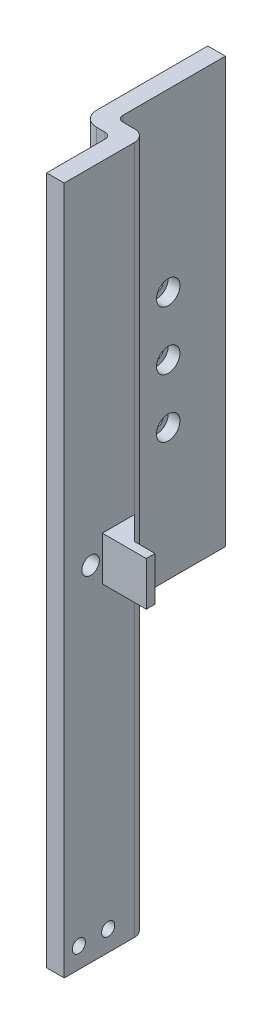
ISO-10303-21;
HEADER;
FILE_DESCRIPTION(('STEP AP214'),'2;1');
FILE_NAME('part.step','',(''),(''),'','','');
FILE_SCHEMA(('AUTOMOTIVE_DESIGN { 1 0 10303 214 1 1 1 1 }'));
ENDSEC;
DATA;
#1=APPLICATION_CONTEXT('core data for automotive mechanical design processes');
#2=APPLICATION_PROTOCOL_DEFINITION('international standard','automotive_design',2000,#1);
#3=PRODUCT_CONTEXT('',#1,'mechanical');
#4=PRODUCT('Part','Part','',(#3));
#5=PRODUCT_RELATED_PRODUCT_CATEGORY('part','',(#4));
#6=PRODUCT_DEFINITION_FORMATION('','',#4);
#7=PRODUCT_DEFINITION_CONTEXT('part definition',#1,'design');
#8=PRODUCT_DEFINITION('design','',#6,#7);
#9=PRODUCT_DEFINITION_SHAPE('','',#8);
#10=(LENGTH_UNIT() NAMED_UNIT(*) SI_UNIT(.MILLI.,.METRE.));
#11=(NAMED_UNIT(*) PLANE_ANGLE_UNIT() SI_UNIT($,.RADIAN.));
#12=(NAMED_UNIT(*) SI_UNIT($,.STERADIAN.) SOLID_ANGLE_UNIT());
#13=UNCERTAINTY_MEASURE_WITH_UNIT(LENGTH_MEASURE(1.E-05),#10,'distance_accuracy_value','');
#14=(GEOMETRIC_REPRESENTATION_CONTEXT(3) GLOBAL_UNCERTAINTY_ASSIGNED_CONTEXT((#13)) GLOBAL_UNIT_ASSIGNED_CONTEXT((#10,
#11,#12)) REPRESENTATION_CONTEXT('',''));
#15=CARTESIAN_POINT('',(0.,0.,0.));
#16=DIRECTION('',(0.,0.,1.));
#17=DIRECTION('',(1.,0.,0.));
#18=AXIS2_PLACEMENT_3D('',#15,#16,#17);
#19=CARTESIAN_POINT('',(16.,0.,0.));
#20=DIRECTION('',(-1.,0.,0.));
#21=DIRECTION('',(0.,0.,1.));
#22=AXIS2_PLACEMENT_3D('',#19,#20,#21);
#23=PLANE('',#22);
#24=CARTESIAN_POINT('',(16.,117.5,13.));
#25=DIRECTION('',(1.,0.,0.));
#26=DIRECTION('',(0.,0.,-1.));
#27=AXIS2_PLACEMENT_3D('',#24,#25,#26);
#28=CIRCLE('',#27,3.);
#29=CARTESIAN_POINT('',(16.,117.5,10.));
#30=VERTEX_POINT('',#29);
#31=EDGE_CURVE('E434',#30,#30,#28,.T.);
#32=ORIENTED_EDGE('',*,*,#31,.F.);
#33=EDGE_LOOP('',(#32));
#34=FACE_BOUND('',#33,.T.);
#35=DIRECTION('',(0.,0.,1.));
#36=VECTOR('',#35,1.);
#37=CARTESIAN_POINT('',(16.,125.,9.));
#38=LINE('',#37,#36);
#39=CARTESIAN_POINT('',(16.,125.,-2.));
#40=VERTEX_POINT('',#39);
#41=CARTESIAN_POINT('',(16.,125.,9.));
#42=VERTEX_POINT('',#41);
#43=EDGE_CURVE('E61',#40,#42,#38,.T.);
#44=ORIENTED_EDGE('',*,*,#43,.F.);
#45=DIRECTION('',(0.,-1.,0.));
#46=VECTOR('',#45,1.);
#47=CARTESIAN_POINT('',(16.,0.,-2.));
#48=LINE('',#47,#46);
#49=CARTESIAN_POINT('',(16.,235.,-2.));
#50=VERTEX_POINT('',#49);
#51=EDGE_CURVE('E390',#40,#50,#48,.F.);
#52=ORIENTED_EDGE('',*,*,#51,.T.);
#53=DIRECTION('',(0.,0.,-1.));
#54=VECTOR('',#53,1.);
#55=CARTESIAN_POINT('',(16.,235.,22.));
#56=LINE('',#55,#54);
#57=CARTESIAN_POINT('',(16.,235.,22.));
#58=VERTEX_POINT('',#57);
#59=EDGE_CURVE('E322',#58,#50,#56,.T.);
#60=ORIENTED_EDGE('',*,*,#59,.F.);
#61=DIRECTION('',(0.,1.,0.));
#62=VECTOR('',#61,1.);
#63=CARTESIAN_POINT('',(16.,0.,22.));
#64=LINE('',#63,#62);
#65=CARTESIAN_POINT('',(16.,0.,22.));
#66=VERTEX_POINT('',#65);
#67=EDGE_CURVE('E317',#66,#58,#64,.T.);
#68=ORIENTED_EDGE('',*,*,#67,.F.);
#69=DIRECTION('',(0.,0.,1.));
#70=VECTOR('',#69,1.);
#71=CARTESIAN_POINT('',(16.,0.,-43.));
#72=LINE('',#71,#70);
#73=CARTESIAN_POINT('',(16.,0.,-2.));
#74=VERTEX_POINT('',#73);
#75=EDGE_CURVE('E314',#74,#66,#72,.T.);
#76=ORIENTED_EDGE('',*,*,#75,.F.);
#77=CARTESIAN_POINT('',(16.,110.,-2.));
#78=VERTEX_POINT('',#77);
#79=EDGE_CURVE('E391',#74,#78,#48,.F.);
#80=ORIENTED_EDGE('',*,*,#79,.T.);
#81=DIRECTION('',(0.,0.,-1.));
#82=VECTOR('',#81,1.);
#83=CARTESIAN_POINT('',(16.,110.,9.));
#84=LINE('',#83,#82);
#85=CARTESIAN_POINT('',(16.,110.,9.));
#86=VERTEX_POINT('',#85);
#87=EDGE_CURVE('E68',#86,#78,#84,.T.);
#88=ORIENTED_EDGE('',*,*,#87,.F.);
#89=DIRECTION('',(0.,-1.,0.));
#90=VECTOR('',#89,1.);
#91=CARTESIAN_POINT('',(16.,110.,9.));
#92=LINE('',#91,#90);
#93=EDGE_CURVE('E201',#42,#86,#92,.T.);
#94=ORIENTED_EDGE('',*,*,#93,.F.);
#95=EDGE_LOOP('',(#44,#52,#60,#68,#76,#80,#88,#94));
#96=FACE_BOUND('',#95,.T.);
#97=CARTESIAN_POINT('',(16.,7.,7.));
#98=DIRECTION('',(-1.,0.,0.));
#99=DIRECTION('',(0.,0.,1.));
#100=AXIS2_PLACEMENT_3D('',#97,#98,#99);
#101=CIRCLE('',#100,2.24999999999998);
#102=CARTESIAN_POINT('',(16.,7.,9.24999999999998));
#103=VERTEX_POINT('',#102);
#104=EDGE_CURVE('E218',#103,#103,#101,.T.);
#105=ORIENTED_EDGE('',*,*,#104,.T.);
#106=EDGE_LOOP('',(#105));
#107=FACE_BOUND('',#106,.T.);
#108=CARTESIAN_POINT('',(16.,7.,17.));
#109=DIRECTION('',(-1.,0.,0.));
#110=DIRECTION('',(0.,0.,1.));
#111=AXIS2_PLACEMENT_3D('',#108,#109,#110);
#112=CIRCLE('',#111,2.24999999999998);
#113=CARTESIAN_POINT('',(16.,7.,19.25));
#114=VERTEX_POINT('',#113);
#115=EDGE_CURVE('E208',#114,#114,#112,.T.);
#116=ORIENTED_EDGE('',*,*,#115,.T.);
#117=EDGE_LOOP('',(#116));
#118=FACE_BOUND('',#117,.T.);
#119=ADVANCED_FACE('F44',(#34,#96,#107,#118),#23,.F.);
#120=CARTESIAN_POINT('',(10.,235.,0.));
#121=DIRECTION('',(1.,0.,0.));
#122=DIRECTION('',(0.,0.,-1.));
#123=AXIS2_PLACEMENT_3D('',#120,#121,#122);
#124=PLANE('',#123);
#125=CARTESIAN_POINT('',(10.,117.5,13.));
#126=DIRECTION('',(1.,0.,0.));
#127=DIRECTION('',(0.,0.,-1.));
#128=AXIS2_PLACEMENT_3D('',#125,#126,#127);
#129=CIRCLE('',#128,3.);
#130=CARTESIAN_POINT('',(10.,117.5,10.));
#131=VERTEX_POINT('',#130);
#132=EDGE_CURVE('E430',#131,#131,#129,.T.);
#133=ORIENTED_EDGE('',*,*,#132,.T.);
#134=EDGE_LOOP('',(#133));
#135=FACE_BOUND('',#134,.T.);
#136=CARTESIAN_POINT('',(10.,7.,17.));
#137=DIRECTION('',(-1.,0.,0.));
#138=DIRECTION('',(0.,0.,1.));
#139=AXIS2_PLACEMENT_3D('',#136,#137,#138);
#140=CIRCLE('',#139,2.24999999999999);
#141=CARTESIAN_POINT('',(10.,7.,19.25));
#142=VERTEX_POINT('',#141);
#143=EDGE_CURVE('E203',#142,#142,#140,.T.);
#144=ORIENTED_EDGE('',*,*,#143,.F.);
#145=EDGE_LOOP('',(#144));
#146=FACE_BOUND('',#145,.T.);
#147=DIRECTION('',(0.,0.,1.));
#148=VECTOR('',#147,1.);
#149=CARTESIAN_POINT('',(10.,235.,0.));
#150=LINE('',#149,#148);
#151=CARTESIAN_POINT('',(10.,235.,2.));
#152=VERTEX_POINT('',#151);
#153=CARTESIAN_POINT('',(10.,235.,22.));
#154=VERTEX_POINT('',#153);
#155=EDGE_CURVE('E274',#152,#154,#150,.T.);
#156=ORIENTED_EDGE('',*,*,#155,.F.);
#157=DIRECTION('',(0.,-1.,0.));
#158=VECTOR('',#157,1.);
#159=CARTESIAN_POINT('',(10.,0.,2.));
#160=LINE('',#159,#158);
#161=CARTESIAN_POINT('',(10.,0.,2.));
#162=VERTEX_POINT('',#161);
#163=EDGE_CURVE('E354',#152,#162,#160,.T.);
#164=ORIENTED_EDGE('',*,*,#163,.T.);
#165=DIRECTION('',(0.,0.,1.));
#166=VECTOR('',#165,1.);
#167=CARTESIAN_POINT('',(10.,0.,0.));
#168=LINE('',#167,#166);
#169=CARTESIAN_POINT('',(10.,0.,22.));
#170=VERTEX_POINT('',#169);
#171=EDGE_CURVE('E275',#162,#170,#168,.T.);
#172=ORIENTED_EDGE('',*,*,#171,.T.);
#173=DIRECTION('',(0.,-1.,0.));
#174=VECTOR('',#173,1.);
#175=CARTESIAN_POINT('',(10.,235.,22.));
#176=LINE('',#175,#174);
#177=EDGE_CURVE('E278',#154,#170,#176,.T.);
#178=ORIENTED_EDGE('',*,*,#177,.F.);
#179=EDGE_LOOP('',(#156,#164,#172,#178));
#180=FACE_BOUND('',#179,.T.);
#181=CARTESIAN_POINT('',(10.,7.,7.));
#182=DIRECTION('',(-1.,0.,0.));
#183=DIRECTION('',(0.,0.,1.));
#184=AXIS2_PLACEMENT_3D('',#181,#182,#183);
#185=CIRCLE('',#184,2.24999999999999);
#186=CARTESIAN_POINT('',(10.,7.,9.24999999999999));
#187=VERTEX_POINT('',#186);
#188=EDGE_CURVE('E214',#187,#187,#185,.T.);
#189=ORIENTED_EDGE('',*,*,#188,.F.);
#190=EDGE_LOOP('',(#189));
#191=FACE_BOUND('',#190,.T.);
#192=ADVANCED_FACE('F480',(#135,#146,#180,#191),#124,.F.);
#193=CARTESIAN_POINT('',(16.,235.,-43.));
#194=DIRECTION('',(0.,0.,-1.));
#195=DIRECTION('',(-1.,0.,0.));
#196=AXIS2_PLACEMENT_3D('',#193,#194,#195);
#197=PLANE('',#196);
#198=DIRECTION('',(-1.,0.,0.));
#199=VECTOR('',#198,1.);
#200=CARTESIAN_POINT('',(16.,90.,-43.));
#201=LINE('',#200,#199);
#202=CARTESIAN_POINT('',(6.,90.,-43.));
#203=VERTEX_POINT('',#202);
#204=CARTESIAN_POINT('',(0.,90.,-43.));
#205=VERTEX_POINT('',#204);
#206=EDGE_CURVE('E294',#203,#205,#201,.T.);
#207=ORIENTED_EDGE('',*,*,#206,.T.);
#208=DIRECTION('',(0.,-1.,0.));
#209=VECTOR('',#208,1.);
#210=CARTESIAN_POINT('',(0.,235.,-43.));
#211=LINE('',#210,#209);
#212=CARTESIAN_POINT('',(0.,235.,-43.));
#213=VERTEX_POINT('',#212);
#214=EDGE_CURVE('E313',#213,#205,#211,.T.);
#215=ORIENTED_EDGE('',*,*,#214,.F.);
#216=DIRECTION('',(-1.,0.,0.));
#217=VECTOR('',#216,1.);
#218=CARTESIAN_POINT('',(16.,235.,-43.));
#219=LINE('',#218,#217);
#220=CARTESIAN_POINT('',(6.,235.,-43.));
#221=VERTEX_POINT('',#220);
#222=EDGE_CURVE('E336',#221,#213,#219,.T.);
#223=ORIENTED_EDGE('',*,*,#222,.F.);
#224=DIRECTION('',(0.,-1.,0.));
#225=VECTOR('',#224,1.);
#226=CARTESIAN_POINT('',(6.,235.,-43.));
#227=LINE('',#226,#225);
#228=EDGE_CURVE('E307',#221,#203,#227,.T.);
#229=ORIENTED_EDGE('',*,*,#228,.T.);
#230=EDGE_LOOP('',(#207,#215,#223,#229));
#231=FACE_BOUND('',#230,.T.);
#232=ADVANCED_FACE('F543',(#231),#197,.T.);
#233=CARTESIAN_POINT('',(16.,235.,22.));
#234=DIRECTION('',(0.,1.,0.));
#235=DIRECTION('',(0.,0.,1.));
#236=AXIS2_PLACEMENT_3D('',#233,#234,#235);
#237=PLANE('',#236);
#238=DIRECTION('',(0.,0.,-1.));
#239=VECTOR('',#238,1.);
#240=CARTESIAN_POINT('',(0.,235.,22.));
#241=LINE('',#240,#239);
#242=CARTESIAN_POINT('',(0.,235.,-5.));
#243=VERTEX_POINT('',#242);
#244=EDGE_CURVE('E318',#243,#213,#241,.T.);
#245=ORIENTED_EDGE('',*,*,#244,.F.);
#246=CARTESIAN_POINT('',(5.,235.,-5.));
#247=DIRECTION('',(0.,1.,0.));
#248=DIRECTION('',(0.,0.,1.));
#249=AXIS2_PLACEMENT_3D('',#246,#247,#248);
#250=CIRCLE('',#249,5.);
#251=CARTESIAN_POINT('',(5.,235.,0.));
#252=VERTEX_POINT('',#251);
#253=EDGE_CURVE('E409',#243,#252,#250,.T.);
#254=ORIENTED_EDGE('',*,*,#253,.T.);
#255=DIRECTION('',(1.,0.,0.));
#256=VECTOR('',#255,1.);
#257=CARTESIAN_POINT('',(0.,235.,0.));
#258=LINE('',#257,#256);
#259=CARTESIAN_POINT('',(8.,235.,0.));
#260=VERTEX_POINT('',#259);
#261=EDGE_CURVE('E271',#252,#260,#258,.T.);
#262=ORIENTED_EDGE('',*,*,#261,.T.);
#263=CARTESIAN_POINT('',(8.,235.,2.));
#264=DIRECTION('',(0.,1.,0.));
#265=DIRECTION('',(0.,0.,1.));
#266=AXIS2_PLACEMENT_3D('',#263,#264,#265);
#267=CIRCLE('',#266,2.);
#268=EDGE_CURVE('E373',#260,#152,#267,.F.);
#269=ORIENTED_EDGE('',*,*,#268,.T.);
#270=ORIENTED_EDGE('',*,*,#155,.T.);
#271=DIRECTION('',(-1.,0.,0.));
#272=VECTOR('',#271,1.);
#273=CARTESIAN_POINT('',(16.,235.,22.));
#274=LINE('',#273,#272);
#275=EDGE_CURVE('E341',#58,#154,#274,.T.);
#276=ORIENTED_EDGE('',*,*,#275,.F.);
#277=ORIENTED_EDGE('',*,*,#59,.T.);
#278=CARTESIAN_POINT('',(12.,235.,-2.));
#279=DIRECTION('',(0.,1.,0.));
#280=DIRECTION('',(0.,0.,1.));
#281=AXIS2_PLACEMENT_3D('',#278,#279,#280);
#282=CIRCLE('',#281,4.);
#283=CARTESIAN_POINT('',(12.,235.,-6.));
#284=VERTEX_POINT('',#283);
#285=EDGE_CURVE('E395',#50,#284,#282,.T.);
#286=ORIENTED_EDGE('',*,*,#285,.T.);
#287=DIRECTION('',(-1.,0.,0.));
#288=VECTOR('',#287,1.);
#289=CARTESIAN_POINT('',(16.,235.,-6.));
#290=LINE('',#289,#288);
#291=CARTESIAN_POINT('',(8.,235.,-6.));
#292=VERTEX_POINT('',#291);
#293=EDGE_CURVE('E301',#284,#292,#290,.T.);
#294=ORIENTED_EDGE('',*,*,#293,.T.);
#295=CARTESIAN_POINT('',(8.,235.,-8.));
#296=DIRECTION('',(0.,1.,0.));
#297=DIRECTION('',(0.,0.,1.));
#298=AXIS2_PLACEMENT_3D('',#295,#296,#297);
#299=CIRCLE('',#298,2.);
#300=CARTESIAN_POINT('',(6.,235.,-8.));
#301=VERTEX_POINT('',#300);
#302=EDGE_CURVE('E380',#292,#301,#299,.F.);
#303=ORIENTED_EDGE('',*,*,#302,.T.);
#304=DIRECTION('',(0.,0.,-1.));
#305=VECTOR('',#304,1.);
#306=CARTESIAN_POINT('',(6.,235.,-6.00000000000001));
#307=LINE('',#306,#305);
#308=EDGE_CURVE('E304',#301,#221,#307,.T.);
#309=ORIENTED_EDGE('',*,*,#308,.T.);
#310=ORIENTED_EDGE('',*,*,#222,.T.);
#311=EDGE_LOOP('',(#245,#254,#262,#269,#270,#276,#277,#286,#294,#303,#309,#310));
#312=FACE_BOUND('',#311,.T.);
#313=ADVANCED_FACE('F569',(#312),#237,.T.);
#314=CARTESIAN_POINT('',(16.,0.,22.));
#315=DIRECTION('',(0.,0.,1.));
#316=DIRECTION('',(1.,0.,0.));
#317=AXIS2_PLACEMENT_3D('',#314,#315,#316);
#318=PLANE('',#317);
#319=ORIENTED_EDGE('',*,*,#177,.T.);
#320=DIRECTION('',(-1.,0.,0.));
#321=VECTOR('',#320,1.);
#322=CARTESIAN_POINT('',(16.,0.,22.));
#323=LINE('',#322,#321);
#324=EDGE_CURVE('E326',#66,#170,#323,.T.);
#325=ORIENTED_EDGE('',*,*,#324,.F.);
#326=ORIENTED_EDGE('',*,*,#67,.T.);
#327=ORIENTED_EDGE('',*,*,#275,.T.);
#328=EDGE_LOOP('',(#319,#325,#326,#327));
#329=FACE_BOUND('',#328,.T.);
#330=ADVANCED_FACE('F572',(#329),#318,.T.);
#331=CARTESIAN_POINT('',(16.,0.,-43.));
#332=DIRECTION('',(0.,-1.,0.));
#333=DIRECTION('',(0.,0.,-1.));
#334=AXIS2_PLACEMENT_3D('',#331,#332,#333);
#335=PLANE('',#334);
#336=DIRECTION('',(1.,0.,0.));
#337=VECTOR('',#336,1.);
#338=CARTESIAN_POINT('',(0.,0.,0.));
#339=LINE('',#338,#337);
#340=CARTESIAN_POINT('',(5.,0.,0.));
#341=VERTEX_POINT('',#340);
#342=CARTESIAN_POINT('',(8.,0.,0.));
#343=VERTEX_POINT('',#342);
#344=EDGE_CURVE('E270',#341,#343,#339,.T.);
#345=ORIENTED_EDGE('',*,*,#344,.F.);
#346=CARTESIAN_POINT('',(5.,0.,-5.));
#347=DIRECTION('',(0.,-1.,0.));
#348=DIRECTION('',(0.,0.,-1.));
#349=AXIS2_PLACEMENT_3D('',#346,#347,#348);
#350=CIRCLE('',#349,5.);
#351=CARTESIAN_POINT('',(0.,0.,-5.));
#352=VERTEX_POINT('',#351);
#353=EDGE_CURVE('E403',#341,#352,#350,.T.);
#354=ORIENTED_EDGE('',*,*,#353,.T.);
#355=DIRECTION('',(0.,0.,1.));
#356=VECTOR('',#355,1.);
#357=CARTESIAN_POINT('',(0.,0.,-43.));
#358=LINE('',#357,#356);
#359=CARTESIAN_POINT('',(0.,0.,-8.));
#360=VERTEX_POINT('',#359);
#361=EDGE_CURVE('E330',#360,#352,#358,.T.);
#362=ORIENTED_EDGE('',*,*,#361,.F.);
#363=DIRECTION('',(-1.,0.,0.));
#364=VECTOR('',#363,1.);
#365=CARTESIAN_POINT('',(16.,0.,-8.));
#366=LINE('',#365,#364);
#367=CARTESIAN_POINT('',(6.,0.,-8.));
#368=VERTEX_POINT('',#367);
#369=EDGE_CURVE('E293',#368,#360,#366,.T.);
#370=ORIENTED_EDGE('',*,*,#369,.F.);
#371=CARTESIAN_POINT('',(8.,0.,-8.));
#372=DIRECTION('',(0.,-1.,0.));
#373=DIRECTION('',(0.,0.,-1.));
#374=AXIS2_PLACEMENT_3D('',#371,#372,#373);
#375=CIRCLE('',#374,2.);
#376=CARTESIAN_POINT('',(8.,0.,-6.));
#377=VERTEX_POINT('',#376);
#378=EDGE_CURVE('E376',#368,#377,#375,.F.);
#379=ORIENTED_EDGE('',*,*,#378,.T.);
#380=DIRECTION('',(-1.,0.,0.));
#381=VECTOR('',#380,1.);
#382=CARTESIAN_POINT('',(16.,0.,-6.));
#383=LINE('',#382,#381);
#384=CARTESIAN_POINT('',(12.,0.,-6.));
#385=VERTEX_POINT('',#384);
#386=EDGE_CURVE('E298',#385,#377,#383,.T.);
#387=ORIENTED_EDGE('',*,*,#386,.F.);
#388=CARTESIAN_POINT('',(12.,0.,-2.));
#389=DIRECTION('',(0.,-1.,0.));
#390=DIRECTION('',(0.,0.,-1.));
#391=AXIS2_PLACEMENT_3D('',#388,#389,#390);
#392=CIRCLE('',#391,4.);
#393=EDGE_CURVE('E387',#385,#74,#392,.T.);
#394=ORIENTED_EDGE('',*,*,#393,.T.);
#395=ORIENTED_EDGE('',*,*,#75,.T.);
#396=ORIENTED_EDGE('',*,*,#324,.T.);
#397=ORIENTED_EDGE('',*,*,#171,.F.);
#398=CARTESIAN_POINT('',(8.,0.,2.));
#399=DIRECTION('',(0.,-1.,0.));
#400=DIRECTION('',(0.,0.,-1.));
#401=AXIS2_PLACEMENT_3D('',#398,#399,#400);
#402=CIRCLE('',#401,2.);
#403=EDGE_CURVE('E369',#162,#343,#402,.F.);
#404=ORIENTED_EDGE('',*,*,#403,.T.);
#405=EDGE_LOOP('',(#345,#354,#362,#370,#379,#387,#394,#395,#396,#397,#404));
#406=FACE_BOUND('',#405,.T.);
#407=ADVANCED_FACE('F567',(#406),#335,.T.);
#408=CARTESIAN_POINT('',(0.,0.,0.));
#409=DIRECTION('',(-1.,0.,0.));
#410=DIRECTION('',(0.,0.,1.));
#411=AXIS2_PLACEMENT_3D('',#408,#409,#410);
#412=PLANE('',#411);
#413=CARTESIAN_POINT('',(0.,175.,-23.5));
#414=DIRECTION('',(1.,0.,0.));
#415=DIRECTION('',(0.,0.,-1.));
#416=AXIS2_PLACEMENT_3D('',#413,#414,#415);
#417=CIRCLE('',#416,2.25);
#418=CARTESIAN_POINT('',(0.,175.,-25.75));
#419=VERTEX_POINT('',#418);
#420=EDGE_CURVE('E234',#419,#419,#417,.T.);
#421=ORIENTED_EDGE('',*,*,#420,.T.);
#422=EDGE_LOOP('',(#421));
#423=FACE_BOUND('',#422,.T.);
#424=CARTESIAN_POINT('',(0.,155.,-23.5));
#425=DIRECTION('',(1.,0.,0.));
#426=DIRECTION('',(0.,0.,-1.));
#427=AXIS2_PLACEMENT_3D('',#424,#425,#426);
#428=CIRCLE('',#427,2.25);
#429=CARTESIAN_POINT('',(0.,155.,-25.75));
#430=VERTEX_POINT('',#429);
#431=EDGE_CURVE('E250',#430,#430,#428,.T.);
#432=ORIENTED_EDGE('',*,*,#431,.T.);
#433=EDGE_LOOP('',(#432));
#434=FACE_BOUND('',#433,.T.);
#435=CARTESIAN_POINT('',(0.,135.,-23.5));
#436=DIRECTION('',(1.,0.,0.));
#437=DIRECTION('',(0.,0.,-1.));
#438=AXIS2_PLACEMENT_3D('',#435,#436,#437);
#439=CIRCLE('',#438,2.25);
#440=CARTESIAN_POINT('',(0.,135.,-25.75));
#441=VERTEX_POINT('',#440);
#442=EDGE_CURVE('E266',#441,#441,#439,.T.);
#443=ORIENTED_EDGE('',*,*,#442,.T.);
#444=EDGE_LOOP('',(#443));
#445=FACE_BOUND('',#444,.T.);
#446=ORIENTED_EDGE('',*,*,#361,.T.);
#447=DIRECTION('',(0.,-1.,0.));
#448=VECTOR('',#447,1.);
#449=CARTESIAN_POINT('',(0.,235.,-5.));
#450=LINE('',#449,#448);
#451=EDGE_CURVE('E406',#352,#243,#450,.F.);
#452=ORIENTED_EDGE('',*,*,#451,.T.);
#453=ORIENTED_EDGE('',*,*,#244,.T.);
#454=ORIENTED_EDGE('',*,*,#214,.T.);
#455=DIRECTION('',(0.,0.,-1.));
#456=VECTOR('',#455,1.);
#457=CARTESIAN_POINT('',(0.,90.,-8.));
#458=LINE('',#457,#456);
#459=CARTESIAN_POINT('',(0.,90.,-14.));
#460=VERTEX_POINT('',#459);
#461=EDGE_CURVE('E290',#460,#205,#458,.T.);
#462=ORIENTED_EDGE('',*,*,#461,.F.);
#463=CARTESIAN_POINT('',(0.,84.,-14.));
#464=DIRECTION('',(-1.,0.,0.));
#465=DIRECTION('',(0.,0.,1.));
#466=AXIS2_PLACEMENT_3D('',#463,#464,#465);
#467=CIRCLE('',#466,6.);
#468=CARTESIAN_POINT('',(0.,84.,-8.));
#469=VERTEX_POINT('',#468);
#470=EDGE_CURVE('E420',#460,#469,#467,.F.);
#471=ORIENTED_EDGE('',*,*,#470,.T.);
#472=DIRECTION('',(0.,1.,0.));
#473=VECTOR('',#472,1.);
#474=CARTESIAN_POINT('',(0.,0.,-8.));
#475=LINE('',#474,#473);
#476=EDGE_CURVE('E286',#360,#469,#475,.T.);
#477=ORIENTED_EDGE('',*,*,#476,.F.);
#478=EDGE_LOOP('',(#446,#452,#453,#454,#462,#471,#477));
#479=FACE_BOUND('',#478,.T.);
#480=ADVANCED_FACE('F560',(#423,#434,#445,#479),#412,.T.);
#481=CARTESIAN_POINT('',(6.,235.,-6.00000000000001));
#482=DIRECTION('',(-1.,0.,0.));
#483=DIRECTION('',(0.,0.,1.));
#484=AXIS2_PLACEMENT_3D('',#481,#482,#483);
#485=PLANE('',#484);
#486=CARTESIAN_POINT('',(6.,175.,-23.5));
#487=DIRECTION('',(1.,0.,0.));
#488=DIRECTION('',(0.,0.,-1.));
#489=AXIS2_PLACEMENT_3D('',#486,#487,#488);
#490=CIRCLE('',#489,4.);
#491=CARTESIAN_POINT('',(6.,175.,-27.5));
#492=VERTEX_POINT('',#491);
#493=EDGE_CURVE('E222',#492,#492,#490,.T.);
#494=ORIENTED_EDGE('',*,*,#493,.F.);
#495=EDGE_LOOP('',(#494));
#496=FACE_BOUND('',#495,.T.);
#497=CARTESIAN_POINT('',(6.,155.,-23.5));
#498=DIRECTION('',(1.,0.,0.));
#499=DIRECTION('',(0.,0.,-1.));
#500=AXIS2_PLACEMENT_3D('',#497,#498,#499);
#501=CIRCLE('',#500,4.);
#502=CARTESIAN_POINT('',(6.,155.,-27.5));
#503=VERTEX_POINT('',#502);
#504=EDGE_CURVE('E238',#503,#503,#501,.T.);
#505=ORIENTED_EDGE('',*,*,#504,.F.);
#506=EDGE_LOOP('',(#505));
#507=FACE_BOUND('',#506,.T.);
#508=CARTESIAN_POINT('',(6.,135.,-23.5));
#509=DIRECTION('',(1.,0.,0.));
#510=DIRECTION('',(0.,0.,-1.));
#511=AXIS2_PLACEMENT_3D('',#508,#509,#510);
#512=CIRCLE('',#511,4.);
#513=CARTESIAN_POINT('',(6.,135.,-27.5));
#514=VERTEX_POINT('',#513);
#515=EDGE_CURVE('E254',#514,#514,#512,.T.);
#516=ORIENTED_EDGE('',*,*,#515,.F.);
#517=EDGE_LOOP('',(#516));
#518=FACE_BOUND('',#517,.T.);
#519=ORIENTED_EDGE('',*,*,#308,.F.);
#520=DIRECTION('',(0.,-1.,0.));
#521=VECTOR('',#520,1.);
#522=CARTESIAN_POINT('',(6.,0.,-8.));
#523=LINE('',#522,#521);
#524=CARTESIAN_POINT('',(6.,84.,-8.));
#525=VERTEX_POINT('',#524);
#526=EDGE_CURVE('E362',#301,#525,#523,.T.);
#527=ORIENTED_EDGE('',*,*,#526,.T.);
#528=CARTESIAN_POINT('',(6.,84.,-14.));
#529=DIRECTION('',(-1.,0.,0.));
#530=DIRECTION('',(0.,0.,1.));
#531=AXIS2_PLACEMENT_3D('',#528,#529,#530);
#532=CIRCLE('',#531,6.);
#533=CARTESIAN_POINT('',(6.,90.,-14.));
#534=VERTEX_POINT('',#533);
#535=EDGE_CURVE('E423',#525,#534,#532,.T.);
#536=ORIENTED_EDGE('',*,*,#535,.T.);
#537=DIRECTION('',(0.,0.,-1.));
#538=VECTOR('',#537,1.);
#539=CARTESIAN_POINT('',(6.,90.,-6.00000000000001));
#540=LINE('',#539,#538);
#541=EDGE_CURVE('E351',#534,#203,#540,.T.);
#542=ORIENTED_EDGE('',*,*,#541,.T.);
#543=ORIENTED_EDGE('',*,*,#228,.F.);
#544=EDGE_LOOP('',(#519,#527,#536,#542,#543));
#545=FACE_BOUND('',#544,.T.);
#546=ADVANCED_FACE('F557',(#496,#507,#518,#545),#485,.F.);
#547=CARTESIAN_POINT('',(16.,235.,-6.));
#548=DIRECTION('',(0.,0.,1.));
#549=DIRECTION('',(1.,0.,0.));
#550=AXIS2_PLACEMENT_3D('',#547,#548,#549);
#551=PLANE('',#550);
#552=ORIENTED_EDGE('',*,*,#293,.F.);
#553=DIRECTION('',(0.,-1.,0.));
#554=VECTOR('',#553,1.);
#555=CARTESIAN_POINT('',(12.,235.,-6.));
#556=LINE('',#555,#554);
#557=EDGE_CURVE('E383',#284,#385,#556,.T.);
#558=ORIENTED_EDGE('',*,*,#557,.T.);
#559=ORIENTED_EDGE('',*,*,#386,.T.);
#560=DIRECTION('',(0.,-1.,0.));
#561=VECTOR('',#560,1.);
#562=CARTESIAN_POINT('',(8.,235.,-6.));
#563=LINE('',#562,#561);
#564=EDGE_CURVE('E365',#377,#292,#563,.F.);
#565=ORIENTED_EDGE('',*,*,#564,.T.);
#566=EDGE_LOOP('',(#552,#558,#559,#565));
#567=FACE_BOUND('',#566,.T.);
#568=ADVANCED_FACE('F552',(#567),#551,.F.);
#569=CARTESIAN_POINT('',(16.,90.,-8.));
#570=DIRECTION('',(0.,1.,0.));
#571=DIRECTION('',(-1.,0.,0.));
#572=AXIS2_PLACEMENT_3D('',#569,#570,#571);
#573=PLANE('',#572);
#574=ORIENTED_EDGE('',*,*,#541,.F.);
#575=DIRECTION('',(-1.,0.,0.));
#576=VECTOR('',#575,1.);
#577=CARTESIAN_POINT('',(0.,90.,-14.));
#578=LINE('',#577,#576);
#579=EDGE_CURVE('E412',#534,#460,#578,.T.);
#580=ORIENTED_EDGE('',*,*,#579,.T.);
#581=ORIENTED_EDGE('',*,*,#461,.T.);
#582=ORIENTED_EDGE('',*,*,#206,.F.);
#583=EDGE_LOOP('',(#574,#580,#581,#582));
#584=FACE_BOUND('',#583,.T.);
#585=ADVANCED_FACE('F549',(#584),#573,.F.);
#586=CARTESIAN_POINT('',(16.,0.,-8.));
#587=DIRECTION('',(0.,0.,1.));
#588=DIRECTION('',(1.,0.,0.));
#589=AXIS2_PLACEMENT_3D('',#586,#587,#588);
#590=PLANE('',#589);
#591=ORIENTED_EDGE('',*,*,#476,.T.);
#592=DIRECTION('',(-1.,0.,0.));
#593=VECTOR('',#592,1.);
#594=CARTESIAN_POINT('',(6.,84.,-8.));
#595=LINE('',#594,#593);
#596=EDGE_CURVE('E416',#469,#525,#595,.F.);
#597=ORIENTED_EDGE('',*,*,#596,.T.);
#598=DIRECTION('',(0.,1.,0.));
#599=VECTOR('',#598,1.);
#600=CARTESIAN_POINT('',(6.,235.,-8.));
#601=LINE('',#600,#599);
#602=EDGE_CURVE('E340',#368,#525,#601,.T.);
#603=ORIENTED_EDGE('',*,*,#602,.F.);
#604=ORIENTED_EDGE('',*,*,#369,.T.);
#605=EDGE_LOOP('',(#591,#597,#603,#604));
#606=FACE_BOUND('',#605,.T.);
#607=ADVANCED_FACE('F547',(#606),#590,.F.);
#608=CARTESIAN_POINT('',(0.,235.,0.));
#609=DIRECTION('',(0.,0.,-1.));
#610=DIRECTION('',(-1.,0.,0.));
#611=AXIS2_PLACEMENT_3D('',#608,#609,#610);
#612=PLANE('',#611);
#613=ORIENTED_EDGE('',*,*,#261,.F.);
#614=DIRECTION('',(0.,-1.,0.));
#615=VECTOR('',#614,1.);
#616=CARTESIAN_POINT('',(5.,0.,0.));
#617=LINE('',#616,#615);
#618=EDGE_CURVE('E399',#252,#341,#617,.T.);
#619=ORIENTED_EDGE('',*,*,#618,.T.);
#620=ORIENTED_EDGE('',*,*,#344,.T.);
#621=DIRECTION('',(0.,-1.,0.));
#622=VECTOR('',#621,1.);
#623=CARTESIAN_POINT('',(8.,235.,0.));
#624=LINE('',#623,#622);
#625=EDGE_CURVE('E358',#343,#260,#624,.F.);
#626=ORIENTED_EDGE('',*,*,#625,.T.);
#627=EDGE_LOOP('',(#613,#619,#620,#626));
#628=FACE_BOUND('',#627,.T.);
#629=ADVANCED_FACE('F539',(#628),#612,.F.);
#630=CARTESIAN_POINT('',(6.,135.,-23.5));
#631=DIRECTION('',(1.,0.,0.));
#632=DIRECTION('',(0.,0.,-1.));
#633=AXIS2_PLACEMENT_3D('',#630,#631,#632);
#634=CYLINDRICAL_SURFACE('',#633,2.25);
#635=ORIENTED_EDGE('',*,*,#442,.F.);
#636=EDGE_LOOP('',(#635));
#637=FACE_BOUND('',#636,.T.);
#638=CARTESIAN_POINT('',(2.,135.,-23.5));
#639=DIRECTION('',(1.,0.,0.));
#640=DIRECTION('',(0.,0.,-1.));
#641=AXIS2_PLACEMENT_3D('',#638,#639,#640);
#642=CIRCLE('',#641,2.25);
#643=CARTESIAN_POINT('',(2.,135.,-25.75));
#644=VERTEX_POINT('',#643);
#645=EDGE_CURVE('E262',#644,#644,#642,.T.);
#646=ORIENTED_EDGE('',*,*,#645,.T.);
#647=EDGE_LOOP('',(#646));
#648=FACE_BOUND('',#647,.T.);
#649=ADVANCED_FACE('F535',(#637,#648),#634,.F.);
#650=CARTESIAN_POINT('',(2.,137.25,-23.5));
#651=DIRECTION('',(-1.,0.,0.));
#652=DIRECTION('',(0.,0.,1.));
#653=AXIS2_PLACEMENT_3D('',#650,#651,#652);
#654=PLANE('',#653);
#655=ORIENTED_EDGE('',*,*,#645,.F.);
#656=EDGE_LOOP('',(#655));
#657=FACE_BOUND('',#656,.T.);
#658=CARTESIAN_POINT('',(2.,135.,-23.5));
#659=DIRECTION('',(1.,0.,0.));
#660=DIRECTION('',(0.,0.,-1.));
#661=AXIS2_PLACEMENT_3D('',#658,#659,#660);
#662=CIRCLE('',#661,4.);
#663=CARTESIAN_POINT('',(2.,135.,-27.5));
#664=VERTEX_POINT('',#663);
#665=EDGE_CURVE('E258',#664,#664,#662,.T.);
#666=ORIENTED_EDGE('',*,*,#665,.T.);
#667=EDGE_LOOP('',(#666));
#668=FACE_BOUND('',#667,.T.);
#669=ADVANCED_FACE('F531',(#657,#668),#654,.F.);
#670=CARTESIAN_POINT('',(6.,135.,-23.5));
#671=DIRECTION('',(1.,0.,0.));
#672=DIRECTION('',(0.,0.,-1.));
#673=AXIS2_PLACEMENT_3D('',#670,#671,#672);
#674=CYLINDRICAL_SURFACE('',#673,4.);
#675=ORIENTED_EDGE('',*,*,#665,.F.);
#676=EDGE_LOOP('',(#675));
#677=FACE_BOUND('',#676,.T.);
#678=ORIENTED_EDGE('',*,*,#515,.T.);
#679=EDGE_LOOP('',(#678));
#680=FACE_BOUND('',#679,.T.);
#681=ADVANCED_FACE('F527',(#677,#680),#674,.F.);
#682=CARTESIAN_POINT('',(6.,155.,-23.5));
#683=DIRECTION('',(1.,0.,0.));
#684=DIRECTION('',(0.,0.,-1.));
#685=AXIS2_PLACEMENT_3D('',#682,#683,#684);
#686=CYLINDRICAL_SURFACE('',#685,2.25);
#687=ORIENTED_EDGE('',*,*,#431,.F.);
#688=EDGE_LOOP('',(#687));
#689=FACE_BOUND('',#688,.T.);
#690=CARTESIAN_POINT('',(2.,155.,-23.5));
#691=DIRECTION('',(1.,0.,0.));
#692=DIRECTION('',(0.,0.,-1.));
#693=AXIS2_PLACEMENT_3D('',#690,#691,#692);
#694=CIRCLE('',#693,2.25);
#695=CARTESIAN_POINT('',(2.,155.,-25.75));
#696=VERTEX_POINT('',#695);
#697=EDGE_CURVE('E246',#696,#696,#694,.T.);
#698=ORIENTED_EDGE('',*,*,#697,.T.);
#699=EDGE_LOOP('',(#698));
#700=FACE_BOUND('',#699,.T.);
#701=ADVANCED_FACE('F523',(#689,#700),#686,.F.);
#702=CARTESIAN_POINT('',(2.,157.25,-23.5));
#703=DIRECTION('',(-1.,0.,0.));
#704=DIRECTION('',(0.,0.,1.));
#705=AXIS2_PLACEMENT_3D('',#702,#703,#704);
#706=PLANE('',#705);
#707=ORIENTED_EDGE('',*,*,#697,.F.);
#708=EDGE_LOOP('',(#707));
#709=FACE_BOUND('',#708,.T.);
#710=CARTESIAN_POINT('',(2.,155.,-23.5));
#711=DIRECTION('',(1.,0.,0.));
#712=DIRECTION('',(0.,0.,-1.));
#713=AXIS2_PLACEMENT_3D('',#710,#711,#712);
#714=CIRCLE('',#713,4.);
#715=CARTESIAN_POINT('',(2.,155.,-27.5));
#716=VERTEX_POINT('',#715);
#717=EDGE_CURVE('E242',#716,#716,#714,.T.);
#718=ORIENTED_EDGE('',*,*,#717,.T.);
#719=EDGE_LOOP('',(#718));
#720=FACE_BOUND('',#719,.T.);
#721=ADVANCED_FACE('F519',(#709,#720),#706,.F.);
#722=CARTESIAN_POINT('',(6.,155.,-23.5));
#723=DIRECTION('',(1.,0.,0.));
#724=DIRECTION('',(0.,0.,-1.));
#725=AXIS2_PLACEMENT_3D('',#722,#723,#724);
#726=CYLINDRICAL_SURFACE('',#725,4.);
#727=ORIENTED_EDGE('',*,*,#717,.F.);
#728=EDGE_LOOP('',(#727));
#729=FACE_BOUND('',#728,.T.);
#730=ORIENTED_EDGE('',*,*,#504,.T.);
#731=EDGE_LOOP('',(#730));
#732=FACE_BOUND('',#731,.T.);
#733=ADVANCED_FACE('F515',(#729,#732),#726,.F.);
#734=CARTESIAN_POINT('',(6.,175.,-23.5));
#735=DIRECTION('',(1.,0.,0.));
#736=DIRECTION('',(0.,0.,-1.));
#737=AXIS2_PLACEMENT_3D('',#734,#735,#736);
#738=CYLINDRICAL_SURFACE('',#737,2.25);
#739=ORIENTED_EDGE('',*,*,#420,.F.);
#740=EDGE_LOOP('',(#739));
#741=FACE_BOUND('',#740,.T.);
#742=CARTESIAN_POINT('',(2.,175.,-23.5));
#743=DIRECTION('',(1.,0.,0.));
#744=DIRECTION('',(0.,0.,-1.));
#745=AXIS2_PLACEMENT_3D('',#742,#743,#744);
#746=CIRCLE('',#745,2.25);
#747=CARTESIAN_POINT('',(2.,175.,-25.75));
#748=VERTEX_POINT('',#747);
#749=EDGE_CURVE('E230',#748,#748,#746,.T.);
#750=ORIENTED_EDGE('',*,*,#749,.T.);
#751=EDGE_LOOP('',(#750));
#752=FACE_BOUND('',#751,.T.);
#753=ADVANCED_FACE('F511',(#741,#752),#738,.F.);
#754=CARTESIAN_POINT('',(2.,177.25,-23.5));
#755=DIRECTION('',(-1.,0.,0.));
#756=DIRECTION('',(0.,0.,1.));
#757=AXIS2_PLACEMENT_3D('',#754,#755,#756);
#758=PLANE('',#757);
#759=ORIENTED_EDGE('',*,*,#749,.F.);
#760=EDGE_LOOP('',(#759));
#761=FACE_BOUND('',#760,.T.);
#762=CARTESIAN_POINT('',(2.,175.,-23.5));
#763=DIRECTION('',(1.,0.,0.));
#764=DIRECTION('',(0.,0.,-1.));
#765=AXIS2_PLACEMENT_3D('',#762,#763,#764);
#766=CIRCLE('',#765,4.);
#767=CARTESIAN_POINT('',(2.,175.,-27.5));
#768=VERTEX_POINT('',#767);
#769=EDGE_CURVE('E226',#768,#768,#766,.T.);
#770=ORIENTED_EDGE('',*,*,#769,.T.);
#771=EDGE_LOOP('',(#770));
#772=FACE_BOUND('',#771,.T.);
#773=ADVANCED_FACE('F507',(#761,#772),#758,.F.);
#774=CARTESIAN_POINT('',(6.,175.,-23.5));
#775=DIRECTION('',(1.,0.,0.));
#776=DIRECTION('',(0.,0.,-1.));
#777=AXIS2_PLACEMENT_3D('',#774,#775,#776);
#778=CYLINDRICAL_SURFACE('',#777,4.);
#779=ORIENTED_EDGE('',*,*,#769,.F.);
#780=EDGE_LOOP('',(#779));
#781=FACE_BOUND('',#780,.T.);
#782=ORIENTED_EDGE('',*,*,#493,.T.);
#783=EDGE_LOOP('',(#782));
#784=FACE_BOUND('',#783,.T.);
#785=ADVANCED_FACE('F503',(#781,#784),#778,.F.);
#786=CARTESIAN_POINT('',(8.,235.,2.));
#787=DIRECTION('',(0.,1.,0.));
#788=DIRECTION('',(0.,0.,1.));
#789=AXIS2_PLACEMENT_3D('',#786,#787,#788);
#790=CYLINDRICAL_SURFACE('',#789,2.);
#791=ORIENTED_EDGE('',*,*,#268,.F.);
#792=ORIENTED_EDGE('',*,*,#625,.F.);
#793=ORIENTED_EDGE('',*,*,#403,.F.);
#794=ORIENTED_EDGE('',*,*,#163,.F.);
#795=EDGE_LOOP('',(#791,#792,#793,#794));
#796=FACE_BOUND('',#795,.T.);
#797=ADVANCED_FACE('F506',(#796),#790,.F.);
#798=CARTESIAN_POINT('',(8.,235.,-8.));
#799=DIRECTION('',(0.,1.,0.));
#800=DIRECTION('',(0.,0.,1.));
#801=AXIS2_PLACEMENT_3D('',#798,#799,#800);
#802=CYLINDRICAL_SURFACE('',#801,2.);
#803=ORIENTED_EDGE('',*,*,#302,.F.);
#804=ORIENTED_EDGE('',*,*,#564,.F.);
#805=ORIENTED_EDGE('',*,*,#378,.F.);
#806=ORIENTED_EDGE('',*,*,#602,.T.);
#807=ORIENTED_EDGE('',*,*,#526,.F.);
#808=EDGE_LOOP('',(#803,#804,#805,#806,#807));
#809=FACE_BOUND('',#808,.T.);
#810=ADVANCED_FACE('F585',(#809),#802,.F.);
#811=CARTESIAN_POINT('',(12.,235.,-2.));
#812=DIRECTION('',(0.,-1.,0.));
#813=DIRECTION('',(0.,0.,-1.));
#814=AXIS2_PLACEMENT_3D('',#811,#812,#813);
#815=CYLINDRICAL_SURFACE('',#814,4.);
#816=ORIENTED_EDGE('',*,*,#285,.F.);
#817=ORIENTED_EDGE('',*,*,#51,.F.);
#818=EDGE_CURVE('E396',#78,#40,#48,.F.);
#819=ORIENTED_EDGE('',*,*,#818,.F.);
#820=ORIENTED_EDGE('',*,*,#79,.F.);
#821=ORIENTED_EDGE('',*,*,#393,.F.);
#822=ORIENTED_EDGE('',*,*,#557,.F.);
#823=EDGE_LOOP('',(#816,#817,#819,#820,#821,#822));
#824=FACE_BOUND('',#823,.T.);
#825=ADVANCED_FACE('F448',(#824),#815,.T.);
#826=CARTESIAN_POINT('',(5.,235.,-5.));
#827=DIRECTION('',(0.,1.,0.));
#828=DIRECTION('',(0.,0.,1.));
#829=AXIS2_PLACEMENT_3D('',#826,#827,#828);
#830=CYLINDRICAL_SURFACE('',#829,5.);
#831=ORIENTED_EDGE('',*,*,#253,.F.);
#832=ORIENTED_EDGE('',*,*,#451,.F.);
#833=ORIENTED_EDGE('',*,*,#353,.F.);
#834=ORIENTED_EDGE('',*,*,#618,.F.);
#835=EDGE_LOOP('',(#831,#832,#833,#834));
#836=FACE_BOUND('',#835,.T.);
#837=ADVANCED_FACE('F592',(#836),#830,.T.);
#838=CARTESIAN_POINT('',(16.,84.,-14.));
#839=DIRECTION('',(1.,0.,0.));
#840=DIRECTION('',(0.,0.,-1.));
#841=AXIS2_PLACEMENT_3D('',#838,#839,#840);
#842=CYLINDRICAL_SURFACE('',#841,6.);
#843=ORIENTED_EDGE('',*,*,#535,.F.);
#844=ORIENTED_EDGE('',*,*,#596,.F.);
#845=ORIENTED_EDGE('',*,*,#470,.F.);
#846=ORIENTED_EDGE('',*,*,#579,.F.);
#847=EDGE_LOOP('',(#843,#844,#845,#846));
#848=FACE_BOUND('',#847,.T.);
#849=ADVANCED_FACE('F498',(#848),#842,.F.);
#850=CARTESIAN_POINT('',(10.,7.,7.));
#851=DIRECTION('',(-1.,0.,0.));
#852=DIRECTION('',(0.,0.,1.));
#853=AXIS2_PLACEMENT_3D('',#850,#851,#852);
#854=CYLINDRICAL_SURFACE('',#853,2.24999999999998);
#855=ORIENTED_EDGE('',*,*,#188,.T.);
#856=EDGE_LOOP('',(#855));
#857=FACE_BOUND('',#856,.T.);
#858=ORIENTED_EDGE('',*,*,#104,.F.);
#859=EDGE_LOOP('',(#858));
#860=FACE_BOUND('',#859,.T.);
#861=ADVANCED_FACE('F489',(#857,#860),#854,.F.);
#862=CARTESIAN_POINT('',(10.,7.,17.));
#863=DIRECTION('',(-1.,0.,0.));
#864=DIRECTION('',(0.,0.,1.));
#865=AXIS2_PLACEMENT_3D('',#862,#863,#864);
#866=CYLINDRICAL_SURFACE('',#865,2.24999999999998);
#867=ORIENTED_EDGE('',*,*,#143,.T.);
#868=EDGE_LOOP('',(#867));
#869=FACE_BOUND('',#868,.T.);
#870=ORIENTED_EDGE('',*,*,#115,.F.);
#871=EDGE_LOOP('',(#870));
#872=FACE_BOUND('',#871,.T.);
#873=ADVANCED_FACE('F487',(#869,#872),#866,.F.);
#874=CARTESIAN_POINT('',(31.,110.,9.));
#875=DIRECTION('',(0.,0.,-1.));
#876=DIRECTION('',(-1.,0.,0.));
#877=AXIS2_PLACEMENT_3D('',#874,#875,#876);
#878=PLANE('',#877);
#879=ORIENTED_EDGE('',*,*,#93,.T.);
#880=DIRECTION('',(-1.,0.,0.));
#881=VECTOR('',#880,1.);
#882=CARTESIAN_POINT('',(31.,110.,9.));
#883=LINE('',#882,#881);
#884=CARTESIAN_POINT('',(31.,110.,9.));
#885=VERTEX_POINT('',#884);
#886=EDGE_CURVE('E181',#885,#86,#883,.T.);
#887=ORIENTED_EDGE('',*,*,#886,.F.);
#888=DIRECTION('',(0.,-1.,0.));
#889=VECTOR('',#888,1.);
#890=CARTESIAN_POINT('',(31.,110.,9.));
#891=LINE('',#890,#889);
#892=CARTESIAN_POINT('',(31.,125.,9.));
#893=VERTEX_POINT('',#892);
#894=EDGE_CURVE('E189',#893,#885,#891,.T.);
#895=ORIENTED_EDGE('',*,*,#894,.F.);
#896=DIRECTION('',(-1.,0.,0.));
#897=VECTOR('',#896,1.);
#898=CARTESIAN_POINT('',(31.,125.,9.));
#899=LINE('',#898,#897);
#900=EDGE_CURVE('E460',#893,#42,#899,.T.);
#901=ORIENTED_EDGE('',*,*,#900,.T.);
#902=EDGE_LOOP('',(#879,#887,#895,#901));
#903=FACE_BOUND('',#902,.T.);
#904=ADVANCED_FACE('F200',(#903),#878,.F.);
#905=CARTESIAN_POINT('',(31.,110.,9.));
#906=DIRECTION('',(0.,1.,0.));
#907=DIRECTION('',(0.,0.,1.));
#908=AXIS2_PLACEMENT_3D('',#905,#906,#907);
#909=PLANE('',#908);
#910=ORIENTED_EDGE('',*,*,#87,.T.);
#911=DIRECTION('',(-0.70710678118655,0.,-0.707106781186545));
#912=VECTOR('',#911,1.);
#913=CARTESIAN_POINT('',(29.,110.,11.));
#914=LINE('',#913,#912);
#915=CARTESIAN_POINT('',(24.,110.,6.));
#916=VERTEX_POINT('',#915);
#917=EDGE_CURVE('E11',#78,#916,#914,.F.);
#918=ORIENTED_EDGE('',*,*,#917,.T.);
#919=DIRECTION('',(-1.,0.,0.));
#920=VECTOR('',#919,1.);
#921=CARTESIAN_POINT('',(31.,110.,6.));
#922=LINE('',#921,#920);
#923=CARTESIAN_POINT('',(31.,110.,6.));
#924=VERTEX_POINT('',#923);
#925=EDGE_CURVE('E184',#924,#916,#922,.T.);
#926=ORIENTED_EDGE('',*,*,#925,.F.);
#927=DIRECTION('',(0.,0.,-1.));
#928=VECTOR('',#927,1.);
#929=CARTESIAN_POINT('',(31.,110.,9.));
#930=LINE('',#929,#928);
#931=EDGE_CURVE('E177',#885,#924,#930,.T.);
#932=ORIENTED_EDGE('',*,*,#931,.F.);
#933=ORIENTED_EDGE('',*,*,#886,.T.);
#934=EDGE_LOOP('',(#910,#918,#926,#932,#933));
#935=FACE_BOUND('',#934,.T.);
#936=ADVANCED_FACE('F179',(#935),#909,.F.);
#937=CARTESIAN_POINT('',(31.,110.,6.));
#938=DIRECTION('',(0.,0.,1.));
#939=DIRECTION('',(1.,0.,0.));
#940=AXIS2_PLACEMENT_3D('',#937,#938,#939);
#941=PLANE('',#940);
#942=ORIENTED_EDGE('',*,*,#925,.T.);
#943=DIRECTION('',(0.,1.,0.));
#944=VECTOR('',#943,1.);
#945=CARTESIAN_POINT('',(24.,125.,6.));
#946=LINE('',#945,#944);
#947=CARTESIAN_POINT('',(24.,125.,6.));
#948=VERTEX_POINT('',#947);
#949=EDGE_CURVE('E426',#916,#948,#946,.T.);
#950=ORIENTED_EDGE('',*,*,#949,.T.);
#951=DIRECTION('',(-1.,0.,0.));
#952=VECTOR('',#951,1.);
#953=CARTESIAN_POINT('',(31.,125.,6.));
#954=LINE('',#953,#952);
#955=CARTESIAN_POINT('',(31.,125.,6.));
#956=VERTEX_POINT('',#955);
#957=EDGE_CURVE('E210',#956,#948,#954,.T.);
#958=ORIENTED_EDGE('',*,*,#957,.F.);
#959=DIRECTION('',(0.,1.,0.));
#960=VECTOR('',#959,1.);
#961=CARTESIAN_POINT('',(31.,110.,6.));
#962=LINE('',#961,#960);
#963=EDGE_CURVE('E188',#924,#956,#962,.T.);
#964=ORIENTED_EDGE('',*,*,#963,.F.);
#965=EDGE_LOOP('',(#942,#950,#958,#964));
#966=FACE_BOUND('',#965,.T.);
#967=ADVANCED_FACE('F456',(#966),#941,.F.);
#968=CARTESIAN_POINT('',(31.,125.,9.));
#969=DIRECTION('',(0.,-1.,0.));
#970=DIRECTION('',(0.,0.,-1.));
#971=AXIS2_PLACEMENT_3D('',#968,#969,#970);
#972=PLANE('',#971);
#973=ORIENTED_EDGE('',*,*,#43,.T.);
#974=ORIENTED_EDGE('',*,*,#900,.F.);
#975=DIRECTION('',(0.,0.,1.));
#976=VECTOR('',#975,1.);
#977=CARTESIAN_POINT('',(31.,125.,9.));
#978=LINE('',#977,#976);
#979=EDGE_CURVE('E194',#956,#893,#978,.T.);
#980=ORIENTED_EDGE('',*,*,#979,.F.);
#981=ORIENTED_EDGE('',*,*,#957,.T.);
#982=DIRECTION('',(0.70710678118655,0.,0.707106781186545));
#983=VECTOR('',#982,1.);
#984=CARTESIAN_POINT('',(29.,125.,11.));
#985=LINE('',#984,#983);
#986=EDGE_CURVE('E54',#948,#40,#985,.F.);
#987=ORIENTED_EDGE('',*,*,#986,.T.);
#988=EDGE_LOOP('',(#973,#974,#980,#981,#987));
#989=FACE_BOUND('',#988,.T.);
#990=ADVANCED_FACE('F441',(#989),#972,.F.);
#991=CARTESIAN_POINT('',(31.,0.,0.));
#992=DIRECTION('',(-1.,0.,0.));
#993=DIRECTION('',(0.,0.,1.));
#994=AXIS2_PLACEMENT_3D('',#991,#992,#993);
#995=PLANE('',#994);
#996=ORIENTED_EDGE('',*,*,#894,.T.);
#997=ORIENTED_EDGE('',*,*,#931,.T.);
#998=ORIENTED_EDGE('',*,*,#963,.T.);
#999=ORIENTED_EDGE('',*,*,#979,.T.);
#1000=EDGE_LOOP('',(#996,#997,#998,#999));
#1001=FACE_BOUND('',#1000,.T.);
#1002=ADVANCED_FACE('F192',(#1001),#995,.F.);
#1003=CARTESIAN_POINT('',(1.,117.5,13.));
#1004=DIRECTION('',(1.,0.,0.));
#1005=DIRECTION('',(0.,0.,-1.));
#1006=AXIS2_PLACEMENT_3D('',#1003,#1004,#1005);
#1007=CYLINDRICAL_SURFACE('',#1006,3.);
#1008=ORIENTED_EDGE('',*,*,#31,.T.);
#1009=EDGE_LOOP('',(#1008));
#1010=FACE_BOUND('',#1009,.T.);
#1011=ORIENTED_EDGE('',*,*,#132,.F.);
#1012=EDGE_LOOP('',(#1011));
#1013=FACE_BOUND('',#1012,.T.);
#1014=ADVANCED_FACE('F476',(#1010,#1013),#1007,.F.);
#1015=CARTESIAN_POINT('',(24.,110.,6.));
#1016=DIRECTION('',(0.707106781186545,0.,-0.70710678118655));
#1017=DIRECTION('',(0.,-1.,0.));
#1018=AXIS2_PLACEMENT_3D('',#1015,#1016,#1017);
#1019=PLANE('',#1018);
#1020=ORIENTED_EDGE('',*,*,#917,.F.);
#1021=ORIENTED_EDGE('',*,*,#818,.T.);
#1022=ORIENTED_EDGE('',*,*,#986,.F.);
#1023=ORIENTED_EDGE('',*,*,#949,.F.);
#1024=EDGE_LOOP('',(#1020,#1021,#1022,#1023));
#1025=FACE_BOUND('',#1024,.T.);
#1026=ADVANCED_FACE('F47',(#1025),#1019,.T.);
#1027=CLOSED_SHELL('',(#119,#192,#232,#313,#330,#407,#480,#546,#568,#585,#607,#629,#649,#669,
#681,#701,#721,#733,#753,#773,#785,#797,#810,#825,#837,#849,#861,#873,#904,#936,#967,#990,#1002,
#1014,#1026));
#1028=MANIFOLD_SOLID_BREP('B2',#1027);
#1029=ADVANCED_BREP_SHAPE_REPRESENTATION('',(#18,#1028),#14);
#1030=SHAPE_DEFINITION_REPRESENTATION(#9,#1029);
ENDSEC;
END-ISO-10303-21;
